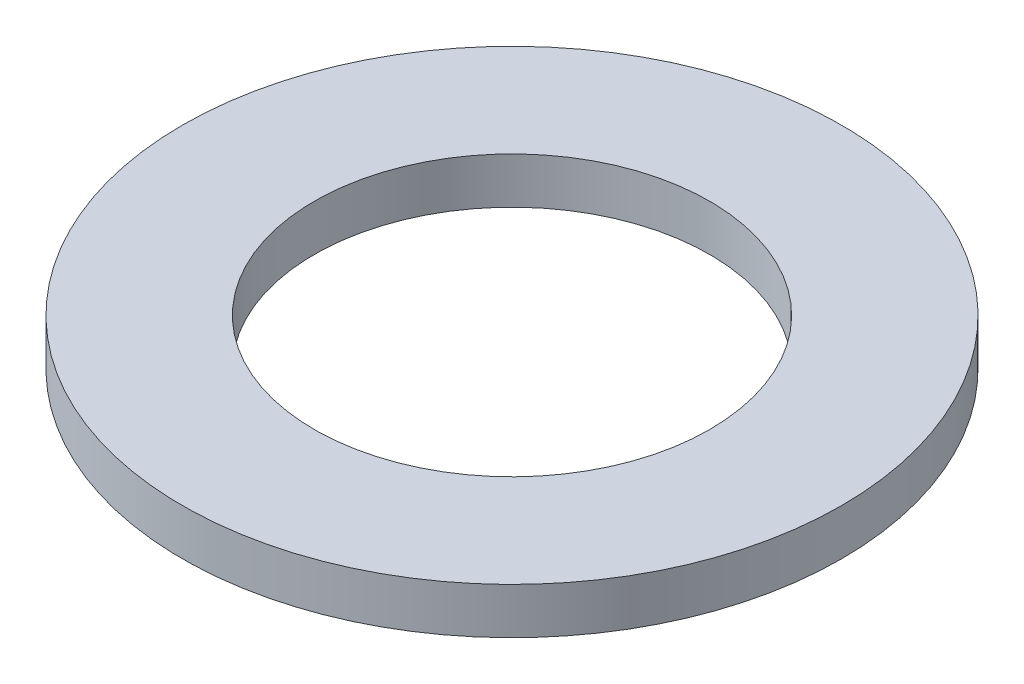
ISO-10303-21;
HEADER;
FILE_DESCRIPTION(('STEP AP214'),'2;1');
FILE_NAME('part.step','',(''),(''),'','','');
FILE_SCHEMA(('AUTOMOTIVE_DESIGN { 1 0 10303 214 1 1 1 1 }'));
ENDSEC;
DATA;
#1=APPLICATION_CONTEXT('core data for automotive mechanical design processes');
#2=APPLICATION_PROTOCOL_DEFINITION('international standard','automotive_design',2000,#1);
#3=PRODUCT_CONTEXT('',#1,'mechanical');
#4=PRODUCT('Part','Part','',(#3));
#5=PRODUCT_RELATED_PRODUCT_CATEGORY('part','',(#4));
#6=PRODUCT_DEFINITION_FORMATION('','',#4);
#7=PRODUCT_DEFINITION_CONTEXT('part definition',#1,'design');
#8=PRODUCT_DEFINITION('design','',#6,#7);
#9=PRODUCT_DEFINITION_SHAPE('','',#8);
#10=(LENGTH_UNIT() NAMED_UNIT(*) SI_UNIT(.MILLI.,.METRE.));
#11=(NAMED_UNIT(*) PLANE_ANGLE_UNIT() SI_UNIT($,.RADIAN.));
#12=(NAMED_UNIT(*) SI_UNIT($,.STERADIAN.) SOLID_ANGLE_UNIT());
#13=UNCERTAINTY_MEASURE_WITH_UNIT(LENGTH_MEASURE(1.E-05),#10,'distance_accuracy_value','');
#14=(GEOMETRIC_REPRESENTATION_CONTEXT(3) GLOBAL_UNCERTAINTY_ASSIGNED_CONTEXT((#13)) GLOBAL_UNIT_ASSIGNED_CONTEXT((#10,
#11,#12)) REPRESENTATION_CONTEXT('',''));
#15=CARTESIAN_POINT('',(0.,0.,0.));
#16=DIRECTION('',(0.,0.,1.));
#17=DIRECTION('',(1.,0.,0.));
#18=AXIS2_PLACEMENT_3D('',#15,#16,#17);
#19=CARTESIAN_POINT('',(0.,0.7,0.));
#20=DIRECTION('',(0.,-1.,0.));
#21=DIRECTION('',(0.,0.,-1.));
#22=AXIS2_PLACEMENT_3D('',#19,#20,#21);
#23=CYLINDRICAL_SURFACE('',#22,3.);
#24=CARTESIAN_POINT('',(0.,0.7,0.));
#25=DIRECTION('',(0.,1.,0.));
#26=DIRECTION('',(1.,0.,0.));
#27=AXIS2_PLACEMENT_3D('',#24,#25,#26);
#28=CIRCLE('',#27,3.);
#29=CARTESIAN_POINT('',(3.,0.7,0.));
#30=VERTEX_POINT('',#29);
#31=EDGE_CURVE('E30',#30,#30,#28,.T.);
#32=ORIENTED_EDGE('',*,*,#31,.T.);
#33=EDGE_LOOP('',(#32));
#34=FACE_BOUND('',#33,.T.);
#35=CARTESIAN_POINT('',(0.,0.,0.));
#36=DIRECTION('',(0.,1.,0.));
#37=DIRECTION('',(1.,0.,0.));
#38=AXIS2_PLACEMENT_3D('',#35,#36,#37);
#39=CIRCLE('',#38,3.);
#40=CARTESIAN_POINT('',(3.,0.,0.));
#41=VERTEX_POINT('',#40);
#42=EDGE_CURVE('E26',#41,#41,#39,.T.);
#43=ORIENTED_EDGE('',*,*,#42,.F.);
#44=EDGE_LOOP('',(#43));
#45=FACE_BOUND('',#44,.T.);
#46=ADVANCED_FACE('F15',(#34,#45),#23,.F.);
#47=CARTESIAN_POINT('',(0.,0.7,0.));
#48=DIRECTION('',(0.,-1.,0.));
#49=DIRECTION('',(0.,0.,-1.));
#50=AXIS2_PLACEMENT_3D('',#47,#48,#49);
#51=CYLINDRICAL_SURFACE('',#50,5.);
#52=CARTESIAN_POINT('',(0.,0.7,0.));
#53=DIRECTION('',(0.,1.,0.));
#54=DIRECTION('',(1.,0.,0.));
#55=AXIS2_PLACEMENT_3D('',#52,#53,#54);
#56=CIRCLE('',#55,5.);
#57=CARTESIAN_POINT('',(5.,0.7,0.));
#58=VERTEX_POINT('',#57);
#59=EDGE_CURVE('E22',#58,#58,#56,.T.);
#60=ORIENTED_EDGE('',*,*,#59,.F.);
#61=EDGE_LOOP('',(#60));
#62=FACE_BOUND('',#61,.T.);
#63=CARTESIAN_POINT('',(0.,0.,0.));
#64=DIRECTION('',(0.,1.,0.));
#65=DIRECTION('',(1.,0.,0.));
#66=AXIS2_PLACEMENT_3D('',#63,#64,#65);
#67=CIRCLE('',#66,5.);
#68=CARTESIAN_POINT('',(5.,0.,0.));
#69=VERTEX_POINT('',#68);
#70=EDGE_CURVE('E10',#69,#69,#67,.T.);
#71=ORIENTED_EDGE('',*,*,#70,.T.);
#72=EDGE_LOOP('',(#71));
#73=FACE_BOUND('',#72,.T.);
#74=ADVANCED_FACE('F40',(#62,#73),#51,.T.);
#75=CARTESIAN_POINT('',(0.,0.7,0.));
#76=DIRECTION('',(0.,1.,0.));
#77=DIRECTION('',(0.,0.,1.));
#78=AXIS2_PLACEMENT_3D('',#75,#76,#77);
#79=PLANE('',#78);
#80=ORIENTED_EDGE('',*,*,#31,.F.);
#81=EDGE_LOOP('',(#80));
#82=FACE_BOUND('',#81,.T.);
#83=ORIENTED_EDGE('',*,*,#59,.T.);
#84=EDGE_LOOP('',(#83));
#85=FACE_BOUND('',#84,.T.);
#86=ADVANCED_FACE('F38',(#82,#85),#79,.T.);
#87=CARTESIAN_POINT('',(0.,0.,0.));
#88=DIRECTION('',(0.,1.,0.));
#89=DIRECTION('',(0.,0.,1.));
#90=AXIS2_PLACEMENT_3D('',#87,#88,#89);
#91=PLANE('',#90);
#92=ORIENTED_EDGE('',*,*,#42,.T.);
#93=EDGE_LOOP('',(#92));
#94=FACE_BOUND('',#93,.T.);
#95=ORIENTED_EDGE('',*,*,#70,.F.);
#96=EDGE_LOOP('',(#95));
#97=FACE_BOUND('',#96,.T.);
#98=ADVANCED_FACE('F17',(#94,#97),#91,.F.);
#99=CLOSED_SHELL('',(#46,#74,#86,#98));
#100=MANIFOLD_SOLID_BREP('B1',#99);
#101=ADVANCED_BREP_SHAPE_REPRESENTATION('',(#18,#100),#14);
#102=SHAPE_DEFINITION_REPRESENTATION(#9,#101);
ENDSEC;
END-ISO-10303-21;
